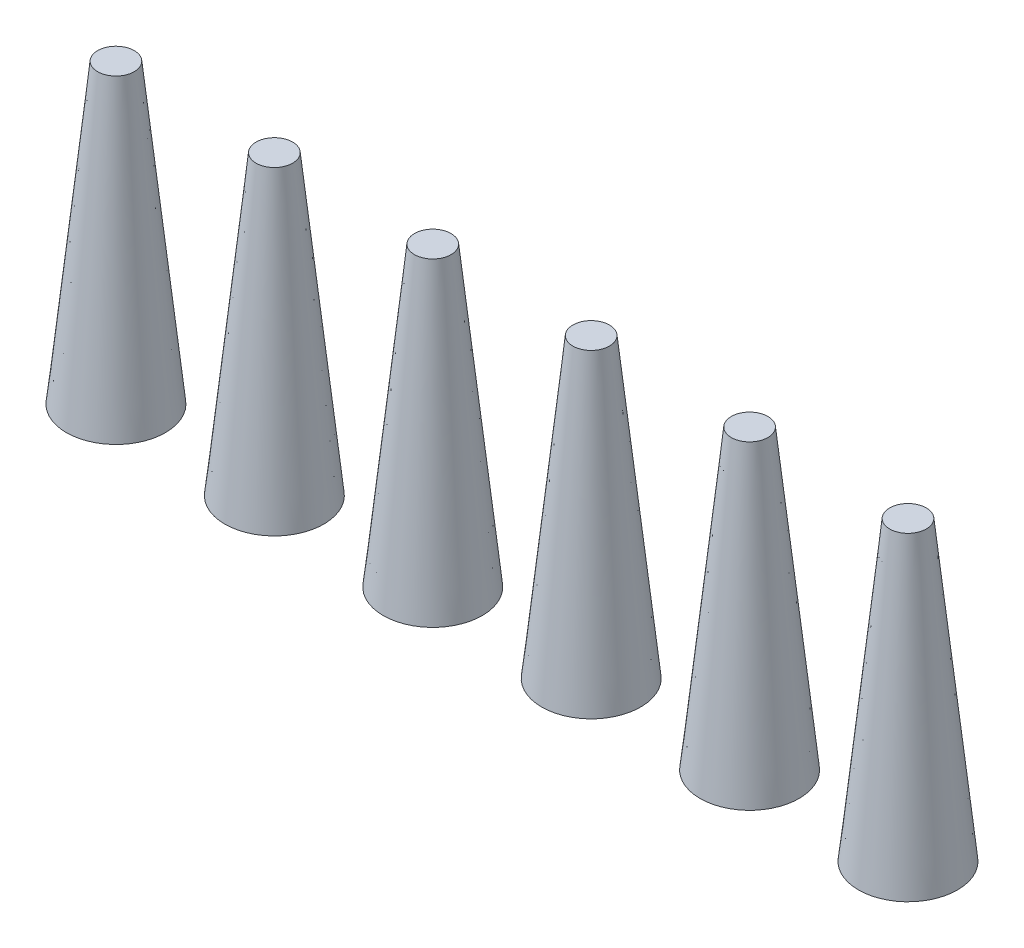
ISO-10303-21;
HEADER;
FILE_DESCRIPTION(('STEP AP214'),'2;1');
FILE_NAME('part.step','',(''),(''),'','','');
FILE_SCHEMA(('AUTOMOTIVE_DESIGN { 1 0 10303 214 1 1 1 1 }'));
ENDSEC;
DATA;
#1=APPLICATION_CONTEXT('core data for automotive mechanical design processes');
#2=APPLICATION_PROTOCOL_DEFINITION('international standard','automotive_design',2000,#1);
#3=PRODUCT_CONTEXT('',#1,'mechanical');
#4=PRODUCT('Part','Part','',(#3));
#5=PRODUCT_RELATED_PRODUCT_CATEGORY('part','',(#4));
#6=PRODUCT_DEFINITION_FORMATION('','',#4);
#7=PRODUCT_DEFINITION_CONTEXT('part definition',#1,'design');
#8=PRODUCT_DEFINITION('design','',#6,#7);
#9=PRODUCT_DEFINITION_SHAPE('','',#8);
#10=(LENGTH_UNIT() NAMED_UNIT(*) SI_UNIT(.MILLI.,.METRE.));
#11=(NAMED_UNIT(*) PLANE_ANGLE_UNIT() SI_UNIT($,.RADIAN.));
#12=(NAMED_UNIT(*) SI_UNIT($,.STERADIAN.) SOLID_ANGLE_UNIT());
#13=UNCERTAINTY_MEASURE_WITH_UNIT(LENGTH_MEASURE(1.E-05),#10,'distance_accuracy_value','');
#14=(GEOMETRIC_REPRESENTATION_CONTEXT(3) GLOBAL_UNCERTAINTY_ASSIGNED_CONTEXT((#13)) GLOBAL_UNIT_ASSIGNED_CONTEXT((#10,
#11,#12)) REPRESENTATION_CONTEXT('',''));
#15=CARTESIAN_POINT('',(0.,0.,0.));
#16=DIRECTION('',(0.,0.,1.));
#17=DIRECTION('',(1.,0.,0.));
#18=AXIS2_PLACEMENT_3D('',#15,#16,#17);
#19=CARTESIAN_POINT('',(40.,0.,0.));
#20=DIRECTION('',(0.,-1.,0.));
#21=DIRECTION('',(0.,0.,1.));
#22=AXIS2_PLACEMENT_3D('',#19,#20,#21);
#23=CONICAL_SURFACE('',#22,2.5,0.10471975511966);
#24=CARTESIAN_POINT('',(40.,15.,0.));
#25=DIRECTION('',(0.,1.,0.));
#26=DIRECTION('',(0.,0.,1.));
#27=AXIS2_PLACEMENT_3D('',#24,#25,#26);
#28=CIRCLE('',#27,0.923436471014848);
#29=CARTESIAN_POINT('',(40.,15.,0.923436471014848));
#30=VERTEX_POINT('',#29);
#31=EDGE_CURVE('E11',#30,#30,#28,.T.);
#32=ORIENTED_EDGE('',*,*,#31,.F.);
#33=EDGE_LOOP('',(#32));
#34=FACE_BOUND('',#33,.T.);
#35=CARTESIAN_POINT('',(40.,0.,0.));
#36=DIRECTION('',(0.,1.,0.));
#37=DIRECTION('',(0.,0.,1.));
#38=AXIS2_PLACEMENT_3D('',#35,#36,#37);
#39=CIRCLE('',#38,2.5);
#40=CARTESIAN_POINT('',(40.,0.,2.5));
#41=VERTEX_POINT('',#40);
#42=EDGE_CURVE('E46',#41,#41,#39,.T.);
#43=ORIENTED_EDGE('',*,*,#42,.T.);
#44=EDGE_LOOP('',(#43));
#45=FACE_BOUND('',#44,.T.);
#46=ADVANCED_FACE('F40',(#34,#45),#23,.T.);
#47=CARTESIAN_POINT('',(40.,15.,0.));
#48=DIRECTION('',(0.,1.,0.));
#49=DIRECTION('',(0.,0.,1.));
#50=AXIS2_PLACEMENT_3D('',#47,#48,#49);
#51=PLANE('',#50);
#52=ORIENTED_EDGE('',*,*,#31,.T.);
#53=EDGE_LOOP('',(#52));
#54=FACE_BOUND('',#53,.T.);
#55=ADVANCED_FACE('F55',(#54),#51,.T.);
#56=CARTESIAN_POINT('',(40.,0.,0.));
#57=DIRECTION('',(0.,1.,0.));
#58=DIRECTION('',(0.,0.,1.));
#59=AXIS2_PLACEMENT_3D('',#56,#57,#58);
#60=PLANE('',#59);
#61=ORIENTED_EDGE('',*,*,#42,.F.);
#62=EDGE_LOOP('',(#61));
#63=FACE_BOUND('',#62,.T.);
#64=ADVANCED_FACE('F53',(#63),#60,.F.);
#65=CLOSED_SHELL('',(#46,#55,#64));
#66=MANIFOLD_SOLID_BREP('B2',#65);
#67=CARTESIAN_POINT('',(32.,0.,0.));
#68=DIRECTION('',(0.,-1.,0.));
#69=DIRECTION('',(0.,0.,1.));
#70=AXIS2_PLACEMENT_3D('',#67,#68,#69);
#71=CONICAL_SURFACE('',#70,2.5,0.10471975511966);
#72=CARTESIAN_POINT('',(32.,15.,0.));
#73=DIRECTION('',(0.,1.,0.));
#74=DIRECTION('',(0.,0.,1.));
#75=AXIS2_PLACEMENT_3D('',#72,#73,#74);
#76=CIRCLE('',#75,0.923436471014848);
#77=CARTESIAN_POINT('',(32.,15.,0.923436471014848));
#78=VERTEX_POINT('',#77);
#79=EDGE_CURVE('E39',#78,#78,#76,.T.);
#80=ORIENTED_EDGE('',*,*,#79,.F.);
#81=EDGE_LOOP('',(#80));
#82=FACE_BOUND('',#81,.T.);
#83=CARTESIAN_POINT('',(32.,0.,0.));
#84=DIRECTION('',(0.,1.,0.));
#85=DIRECTION('',(0.,0.,1.));
#86=AXIS2_PLACEMENT_3D('',#83,#84,#85);
#87=CIRCLE('',#86,2.5);
#88=CARTESIAN_POINT('',(32.,0.,2.5));
#89=VERTEX_POINT('',#88);
#90=EDGE_CURVE('E95',#89,#89,#87,.T.);
#91=ORIENTED_EDGE('',*,*,#90,.T.);
#92=EDGE_LOOP('',(#91));
#93=FACE_BOUND('',#92,.T.);
#94=ADVANCED_FACE('F89',(#82,#93),#71,.T.);
#95=CARTESIAN_POINT('',(32.,15.,0.));
#96=DIRECTION('',(0.,1.,0.));
#97=DIRECTION('',(0.,0.,1.));
#98=AXIS2_PLACEMENT_3D('',#95,#96,#97);
#99=PLANE('',#98);
#100=ORIENTED_EDGE('',*,*,#79,.T.);
#101=EDGE_LOOP('',(#100));
#102=FACE_BOUND('',#101,.T.);
#103=ADVANCED_FACE('F104',(#102),#99,.T.);
#104=CARTESIAN_POINT('',(32.,0.,0.));
#105=DIRECTION('',(0.,1.,0.));
#106=DIRECTION('',(0.,0.,1.));
#107=AXIS2_PLACEMENT_3D('',#104,#105,#106);
#108=PLANE('',#107);
#109=ORIENTED_EDGE('',*,*,#90,.F.);
#110=EDGE_LOOP('',(#109));
#111=FACE_BOUND('',#110,.T.);
#112=ADVANCED_FACE('F102',(#111),#108,.F.);
#113=CLOSED_SHELL('',(#94,#103,#112));
#114=MANIFOLD_SOLID_BREP('B6',#113);
#115=CARTESIAN_POINT('',(16.,0.,0.));
#116=DIRECTION('',(0.,-1.,0.));
#117=DIRECTION('',(0.,0.,1.));
#118=AXIS2_PLACEMENT_3D('',#115,#116,#117);
#119=CONICAL_SURFACE('',#118,2.5,0.10471975511966);
#120=CARTESIAN_POINT('',(16.,15.,0.));
#121=DIRECTION('',(0.,1.,0.));
#122=DIRECTION('',(0.,0.,1.));
#123=AXIS2_PLACEMENT_3D('',#120,#121,#122);
#124=CIRCLE('',#123,0.923436471014854);
#125=CARTESIAN_POINT('',(16.,15.,0.923436471014854));
#126=VERTEX_POINT('',#125);
#127=EDGE_CURVE('E88',#126,#126,#124,.T.);
#128=ORIENTED_EDGE('',*,*,#127,.F.);
#129=EDGE_LOOP('',(#128));
#130=FACE_BOUND('',#129,.T.);
#131=CARTESIAN_POINT('',(16.,0.,0.));
#132=DIRECTION('',(0.,1.,0.));
#133=DIRECTION('',(0.,0.,1.));
#134=AXIS2_PLACEMENT_3D('',#131,#132,#133);
#135=CIRCLE('',#134,2.5);
#136=CARTESIAN_POINT('',(16.,0.,2.5));
#137=VERTEX_POINT('',#136);
#138=EDGE_CURVE('E144',#137,#137,#135,.T.);
#139=ORIENTED_EDGE('',*,*,#138,.T.);
#140=EDGE_LOOP('',(#139));
#141=FACE_BOUND('',#140,.T.);
#142=ADVANCED_FACE('F138',(#130,#141),#119,.T.);
#143=CARTESIAN_POINT('',(16.,15.,0.));
#144=DIRECTION('',(0.,1.,0.));
#145=DIRECTION('',(0.,0.,1.));
#146=AXIS2_PLACEMENT_3D('',#143,#144,#145);
#147=PLANE('',#146);
#148=ORIENTED_EDGE('',*,*,#127,.T.);
#149=EDGE_LOOP('',(#148));
#150=FACE_BOUND('',#149,.T.);
#151=ADVANCED_FACE('F153',(#150),#147,.T.);
#152=CARTESIAN_POINT('',(16.,0.,0.));
#153=DIRECTION('',(0.,1.,0.));
#154=DIRECTION('',(0.,0.,1.));
#155=AXIS2_PLACEMENT_3D('',#152,#153,#154);
#156=PLANE('',#155);
#157=ORIENTED_EDGE('',*,*,#138,.F.);
#158=EDGE_LOOP('',(#157));
#159=FACE_BOUND('',#158,.T.);
#160=ADVANCED_FACE('F151',(#159),#156,.F.);
#161=CLOSED_SHELL('',(#142,#151,#160));
#162=MANIFOLD_SOLID_BREP('B34',#161);
#163=CARTESIAN_POINT('',(8.,0.,0.));
#164=DIRECTION('',(0.,-1.,0.));
#165=DIRECTION('',(0.,0.,1.));
#166=AXIS2_PLACEMENT_3D('',#163,#164,#165);
#167=CONICAL_SURFACE('',#166,2.5,0.10471975511966);
#168=CARTESIAN_POINT('',(8.,15.,0.));
#169=DIRECTION('',(0.,1.,0.));
#170=DIRECTION('',(0.,0.,1.));
#171=AXIS2_PLACEMENT_3D('',#168,#169,#170);
#172=CIRCLE('',#171,0.923436471014851);
#173=CARTESIAN_POINT('',(8.,15.,0.923436471014851));
#174=VERTEX_POINT('',#173);
#175=EDGE_CURVE('E137',#174,#174,#172,.T.);
#176=ORIENTED_EDGE('',*,*,#175,.F.);
#177=EDGE_LOOP('',(#176));
#178=FACE_BOUND('',#177,.T.);
#179=CARTESIAN_POINT('',(8.,0.,0.));
#180=DIRECTION('',(0.,1.,0.));
#181=DIRECTION('',(0.,0.,1.));
#182=AXIS2_PLACEMENT_3D('',#179,#180,#181);
#183=CIRCLE('',#182,2.5);
#184=CARTESIAN_POINT('',(8.,0.,2.5));
#185=VERTEX_POINT('',#184);
#186=EDGE_CURVE('E193',#185,#185,#183,.T.);
#187=ORIENTED_EDGE('',*,*,#186,.T.);
#188=EDGE_LOOP('',(#187));
#189=FACE_BOUND('',#188,.T.);
#190=ADVANCED_FACE('F187',(#178,#189),#167,.T.);
#191=CARTESIAN_POINT('',(8.,15.,0.));
#192=DIRECTION('',(0.,1.,0.));
#193=DIRECTION('',(0.,0.,1.));
#194=AXIS2_PLACEMENT_3D('',#191,#192,#193);
#195=PLANE('',#194);
#196=ORIENTED_EDGE('',*,*,#175,.T.);
#197=EDGE_LOOP('',(#196));
#198=FACE_BOUND('',#197,.T.);
#199=ADVANCED_FACE('F202',(#198),#195,.T.);
#200=CARTESIAN_POINT('',(8.,0.,0.));
#201=DIRECTION('',(0.,1.,0.));
#202=DIRECTION('',(0.,0.,1.));
#203=AXIS2_PLACEMENT_3D('',#200,#201,#202);
#204=PLANE('',#203);
#205=ORIENTED_EDGE('',*,*,#186,.F.);
#206=EDGE_LOOP('',(#205));
#207=FACE_BOUND('',#206,.T.);
#208=ADVANCED_FACE('F200',(#207),#204,.F.);
#209=CLOSED_SHELL('',(#190,#199,#208));
#210=MANIFOLD_SOLID_BREP('B83',#209);
#211=CARTESIAN_POINT('',(24.,0.,0.));
#212=DIRECTION('',(0.,-1.,0.));
#213=DIRECTION('',(0.,0.,1.));
#214=AXIS2_PLACEMENT_3D('',#211,#212,#213);
#215=CONICAL_SURFACE('',#214,2.5,0.10471975511966);
#216=CARTESIAN_POINT('',(24.,15.,0.));
#217=DIRECTION('',(0.,1.,0.));
#218=DIRECTION('',(0.,0.,1.));
#219=AXIS2_PLACEMENT_3D('',#216,#217,#218);
#220=CIRCLE('',#219,0.923436471014854);
#221=CARTESIAN_POINT('',(24.,15.,0.923436471014854));
#222=VERTEX_POINT('',#221);
#223=EDGE_CURVE('E186',#222,#222,#220,.T.);
#224=ORIENTED_EDGE('',*,*,#223,.F.);
#225=EDGE_LOOP('',(#224));
#226=FACE_BOUND('',#225,.T.);
#227=CARTESIAN_POINT('',(24.,0.,0.));
#228=DIRECTION('',(0.,1.,0.));
#229=DIRECTION('',(0.,0.,1.));
#230=AXIS2_PLACEMENT_3D('',#227,#228,#229);
#231=CIRCLE('',#230,2.5);
#232=CARTESIAN_POINT('',(24.,0.,2.5));
#233=VERTEX_POINT('',#232);
#234=EDGE_CURVE('E241',#233,#233,#231,.T.);
#235=ORIENTED_EDGE('',*,*,#234,.T.);
#236=EDGE_LOOP('',(#235));
#237=FACE_BOUND('',#236,.T.);
#238=ADVANCED_FACE('F235',(#226,#237),#215,.T.);
#239=CARTESIAN_POINT('',(24.,15.,0.));
#240=DIRECTION('',(0.,1.,0.));
#241=DIRECTION('',(0.,0.,1.));
#242=AXIS2_PLACEMENT_3D('',#239,#240,#241);
#243=PLANE('',#242);
#244=ORIENTED_EDGE('',*,*,#223,.T.);
#245=EDGE_LOOP('',(#244));
#246=FACE_BOUND('',#245,.T.);
#247=ADVANCED_FACE('F250',(#246),#243,.T.);
#248=CARTESIAN_POINT('',(24.,0.,0.));
#249=DIRECTION('',(0.,1.,0.));
#250=DIRECTION('',(0.,0.,1.));
#251=AXIS2_PLACEMENT_3D('',#248,#249,#250);
#252=PLANE('',#251);
#253=ORIENTED_EDGE('',*,*,#234,.F.);
#254=EDGE_LOOP('',(#253));
#255=FACE_BOUND('',#254,.T.);
#256=ADVANCED_FACE('F248',(#255),#252,.F.);
#257=CLOSED_SHELL('',(#238,#247,#256));
#258=MANIFOLD_SOLID_BREP('B132',#257);
#259=CARTESIAN_POINT('',(0.,0.,0.));
#260=DIRECTION('',(0.,-1.,0.));
#261=DIRECTION('',(0.,0.,1.));
#262=AXIS2_PLACEMENT_3D('',#259,#260,#261);
#263=CONICAL_SURFACE('',#262,2.5,0.10471975511966);
#264=CARTESIAN_POINT('',(0.,15.,0.));
#265=DIRECTION('',(0.,1.,0.));
#266=DIRECTION('',(0.,0.,1.));
#267=AXIS2_PLACEMENT_3D('',#264,#265,#266);
#268=CIRCLE('',#267,0.923436471014853);
#269=CARTESIAN_POINT('',(0.,15.,0.923436471014853));
#270=VERTEX_POINT('',#269);
#271=EDGE_CURVE('E234',#270,#270,#268,.T.);
#272=ORIENTED_EDGE('',*,*,#271,.F.);
#273=EDGE_LOOP('',(#272));
#274=FACE_BOUND('',#273,.T.);
#275=CARTESIAN_POINT('',(0.,0.,0.));
#276=DIRECTION('',(0.,1.,0.));
#277=DIRECTION('',(0.,0.,1.));
#278=AXIS2_PLACEMENT_3D('',#275,#276,#277);
#279=CIRCLE('',#278,2.5);
#280=CARTESIAN_POINT('',(0.,0.,2.5));
#281=VERTEX_POINT('',#280);
#282=EDGE_CURVE('E282',#281,#281,#279,.T.);
#283=ORIENTED_EDGE('',*,*,#282,.T.);
#284=EDGE_LOOP('',(#283));
#285=FACE_BOUND('',#284,.T.);
#286=ADVANCED_FACE('F276',(#274,#285),#263,.T.);
#287=CARTESIAN_POINT('',(0.,15.,0.));
#288=DIRECTION('',(0.,1.,0.));
#289=DIRECTION('',(0.,0.,1.));
#290=AXIS2_PLACEMENT_3D('',#287,#288,#289);
#291=PLANE('',#290);
#292=ORIENTED_EDGE('',*,*,#271,.T.);
#293=EDGE_LOOP('',(#292));
#294=FACE_BOUND('',#293,.T.);
#295=ADVANCED_FACE('F291',(#294),#291,.T.);
#296=CARTESIAN_POINT('',(0.,0.,0.));
#297=DIRECTION('',(0.,1.,0.));
#298=DIRECTION('',(0.,0.,1.));
#299=AXIS2_PLACEMENT_3D('',#296,#297,#298);
#300=PLANE('',#299);
#301=ORIENTED_EDGE('',*,*,#282,.F.);
#302=EDGE_LOOP('',(#301));
#303=FACE_BOUND('',#302,.T.);
#304=ADVANCED_FACE('F289',(#303),#300,.F.);
#305=CLOSED_SHELL('',(#286,#295,#304));
#306=MANIFOLD_SOLID_BREP('B181',#305);
#307=ADVANCED_BREP_SHAPE_REPRESENTATION('',(#18,#66,#114,#162,#210,#258,#306),#14);
#308=SHAPE_DEFINITION_REPRESENTATION(#9,#307);
ENDSEC;
END-ISO-10303-21;
